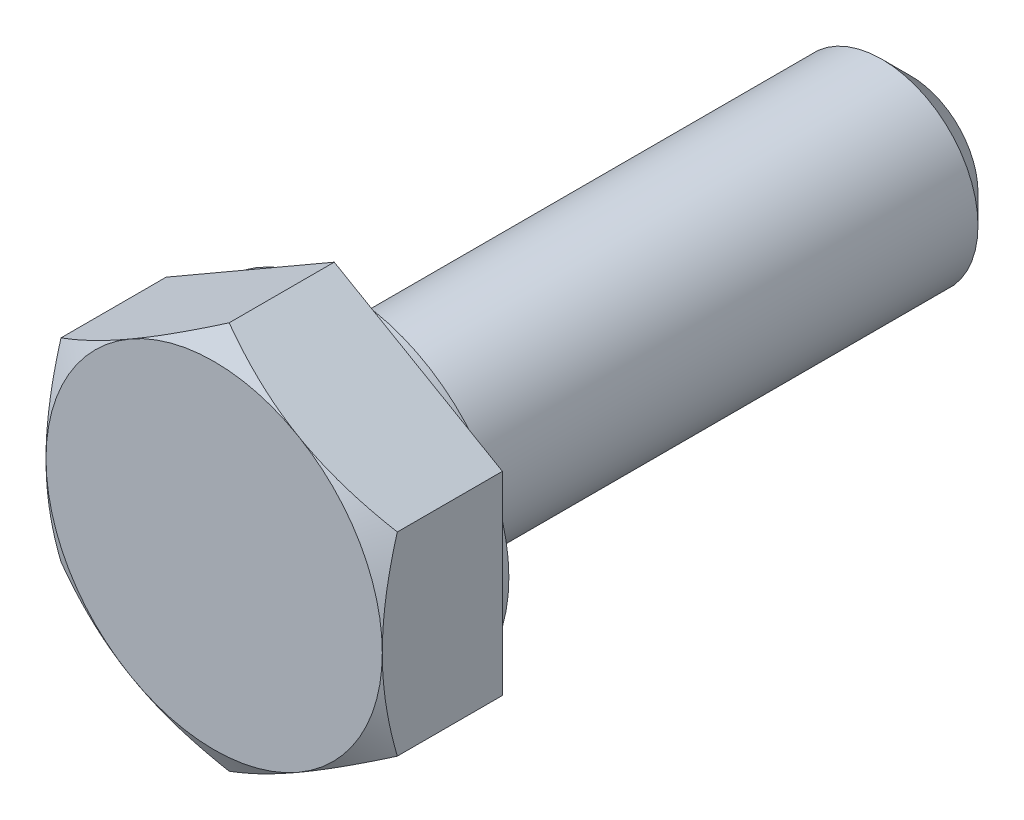
ISO-10303-21;
HEADER;
FILE_DESCRIPTION(('STEP AP214'),'2;1');
FILE_NAME('part.step','',(''),(''),'','','');
FILE_SCHEMA(('AUTOMOTIVE_DESIGN { 1 0 10303 214 1 1 1 1 }'));
ENDSEC;
DATA;
#1=APPLICATION_CONTEXT('core data for automotive mechanical design processes');
#2=APPLICATION_PROTOCOL_DEFINITION('international standard','automotive_design',2000,#1);
#3=PRODUCT_CONTEXT('',#1,'mechanical');
#4=PRODUCT('Part','Part','',(#3));
#5=PRODUCT_RELATED_PRODUCT_CATEGORY('part','',(#4));
#6=PRODUCT_DEFINITION_FORMATION('','',#4);
#7=PRODUCT_DEFINITION_CONTEXT('part definition',#1,'design');
#8=PRODUCT_DEFINITION('design','',#6,#7);
#9=PRODUCT_DEFINITION_SHAPE('','',#8);
#10=(LENGTH_UNIT() NAMED_UNIT(*) SI_UNIT(.MILLI.,.METRE.));
#11=(NAMED_UNIT(*) PLANE_ANGLE_UNIT() SI_UNIT($,.RADIAN.));
#12=(NAMED_UNIT(*) SI_UNIT($,.STERADIAN.) SOLID_ANGLE_UNIT());
#13=UNCERTAINTY_MEASURE_WITH_UNIT(LENGTH_MEASURE(1.E-05),#10,'distance_accuracy_value','');
#14=(GEOMETRIC_REPRESENTATION_CONTEXT(3) GLOBAL_UNCERTAINTY_ASSIGNED_CONTEXT((#13)) GLOBAL_UNIT_ASSIGNED_CONTEXT((#10,
#11,#12)) REPRESENTATION_CONTEXT('',''));
#15=CARTESIAN_POINT('',(0.,0.,0.));
#16=DIRECTION('',(0.,0.,1.));
#17=DIRECTION('',(1.,0.,0.));
#18=AXIS2_PLACEMENT_3D('',#15,#16,#17);
#19=CARTESIAN_POINT('',(5.55624999999998,3.20790243318487,3.96875));
#20=DIRECTION('',(-0.499999999999999,-0.866025403784439,0.));
#21=DIRECTION('',(0.866025403784439,-0.5,0.));
#22=AXIS2_PLACEMENT_3D('',#19,#20,#21);
#23=PLANE('',#22);
#24=CARTESIAN_POINT('',(5.55644999999998,3.20778696313103,3.47241909805179));
#25=CARTESIAN_POINT('',(5.43431700443225,3.278300480999,3.51312443962874));
#26=CARTESIAN_POINT('',(5.31172863757362,3.34907690760434,3.55198246063681));
#27=CARTESIAN_POINT('',(5.06555635055762,3.49120454378006,3.62549506657543));
#28=CARTESIAN_POINT('',(4.94197202526349,3.56255598725624,3.66014783819809));
#29=CARTESIAN_POINT('',(4.56924027919932,3.77775276118191,3.75711811443887));
#30=CARTESIAN_POINT('',(4.31862154881048,3.92244755263587,3.81227394549797));
#31=CARTESIAN_POINT('',(3.94357517172044,4.1389806794074,3.876951095153));
#32=CARTESIAN_POINT('',(3.82026814788995,4.2101720228089,3.89537582963737));
#33=CARTESIAN_POINT('',(3.57309692257776,4.35287639627882,3.92627163375965));
#34=CARTESIAN_POINT('',(3.44923277130252,4.42438939736053,3.93874322943797));
#35=CARTESIAN_POINT('',(3.20128932668296,4.56753961185543,3.95741491340171));
#36=CARTESIAN_POINT('',(3.07721043832554,4.63917659144934,3.96362211931662));
#37=CARTESIAN_POINT('',(2.82894487332449,4.78251278223321,3.96963858258616));
#38=CARTESIAN_POINT('',(2.70475820012893,4.85421199143243,3.96944803757272));
#39=CARTESIAN_POINT('',(2.36452243746778,5.05064720059278,3.96013175730709));
#40=CARTESIAN_POINT('',(2.14858470770917,5.17531890699711,3.94449034031059));
#41=CARTESIAN_POINT('',(1.71814349723525,5.42383425573454,3.89489009502544));
#42=CARTESIAN_POINT('',(1.50364153044715,5.54767702400135,3.86091431173333));
#43=CARTESIAN_POINT('',(1.07233397329163,5.79669255822861,3.77598424995191));
#44=CARTESIAN_POINT('',(0.855582809091892,5.92183390122649,3.72467011195787));
#45=CARTESIAN_POINT('',(0.425312954659244,6.17025031750736,3.6082075447076));
#46=CARTESIAN_POINT('',(0.21178875358562,6.29352857247572,3.54308647412056));
#47=CARTESIAN_POINT('',(-0.000200000000000074,6.41592033642355,3.47241909805179));
#48=B_SPLINE_CURVE_WITH_KNOTS('',3,(#24,#25,#26,#27,#28,#29,#30,#31,#32,#33,#34,#35,#36,#37,#38,
#39,#40,#41,#42,#43,#44,#45,#46,#47),.UNSPECIFIED.,.F.,.F.,(4,2,2,2,2,2,2,2,2,2,2,4),(0.,
0.44031690826804,0.880823012040822,1.76366572331169,2.19427472390782,2.62484566732156,
3.05492684132791,3.48499472977669,4.23370964386674,4.98311813377592,5.74914806559354,
6.5136740501687),.UNSPECIFIED.);
#49=CARTESIAN_POINT('',(5.55624999999998,3.20790243318487,3.4724857665182));
#50=VERTEX_POINT('',#49);
#51=CARTESIAN_POINT('',(2.778125,4.81185364977729,3.96875));
#52=VERTEX_POINT('',#51);
#53=EDGE_CURVE('E112',#50,#52,#48,.T.);
#54=ORIENTED_EDGE('',*,*,#53,.F.);
#55=DIRECTION('',(0.,0.,-1.));
#56=VECTOR('',#55,1.);
#57=CARTESIAN_POINT('',(5.55624999999998,3.20790243318487,3.96875));
#58=LINE('',#57,#56);
#59=CARTESIAN_POINT('',(5.55624999999998,3.20790243318487,0.));
#60=VERTEX_POINT('',#59);
#61=EDGE_CURVE('E61',#50,#60,#58,.T.);
#62=ORIENTED_EDGE('',*,*,#61,.T.);
#63=DIRECTION('',(-0.866025403784439,0.499999999999999,0.));
#64=VECTOR('',#63,1.);
#65=CARTESIAN_POINT('',(5.55624999999998,3.20790243318487,0.));
#66=LINE('',#65,#64);
#67=CARTESIAN_POINT('',(0.,6.41580486636971,0.));
#68=VERTEX_POINT('',#67);
#69=EDGE_CURVE('E243',#60,#68,#66,.T.);
#70=ORIENTED_EDGE('',*,*,#69,.T.);
#71=DIRECTION('',(0.,0.,-1.));
#72=VECTOR('',#71,1.);
#73=CARTESIAN_POINT('',(0.,6.41580486636971,3.96875));
#74=LINE('',#73,#72);
#75=CARTESIAN_POINT('',(0.,6.41580486636971,3.4724857665182));
#76=VERTEX_POINT('',#75);
#77=EDGE_CURVE('E132',#76,#68,#74,.T.);
#78=ORIENTED_EDGE('',*,*,#77,.F.);
#79=EDGE_CURVE('E120',#52,#76,#48,.T.);
#80=ORIENTED_EDGE('',*,*,#79,.F.);
#81=EDGE_LOOP('',(#54,#62,#70,#78,#80));
#82=FACE_BOUND('',#81,.T.);
#83=ADVANCED_FACE('F38',(#82),#23,.F.);
#84=CARTESIAN_POINT('',(0.,6.41580486636971,3.96875));
#85=DIRECTION('',(0.5,-0.866025403784438,0.));
#86=DIRECTION('',(0.866025403784439,0.5,0.));
#87=AXIS2_PLACEMENT_3D('',#84,#85,#86);
#88=PLANE('',#87);
#89=CARTESIAN_POINT('',(0.000199999999999678,6.41592033642355,3.47241909805179));
#90=CARTESIAN_POINT('',(-0.121932995567731,6.34540681855559,3.51312443962873));
#91=CARTESIAN_POINT('',(-0.244521362426353,6.27463039195024,3.5519824606368));
#92=CARTESIAN_POINT('',(-0.490693649442356,6.13250275577453,3.62549506657542));
#93=CARTESIAN_POINT('',(-0.614277974736487,6.06115131229834,3.66014783819809));
#94=CARTESIAN_POINT('',(-0.987009720800662,5.84595453837267,3.75711811443887));
#95=CARTESIAN_POINT('',(-1.2376284511895,5.70125974691871,3.81227394549796));
#96=CARTESIAN_POINT('',(-1.61267482827954,5.48472662014719,3.87695109515299));
#97=CARTESIAN_POINT('',(-1.73598185211002,5.41353527674569,3.89537582963736));
#98=CARTESIAN_POINT('',(-1.98315307742221,5.27083090327576,3.92627163375964));
#99=CARTESIAN_POINT('',(-2.10701722869746,5.19931790219406,3.93874322943797));
#100=CARTESIAN_POINT('',(-2.35496067331701,5.05616768769915,3.95741491340171));
#101=CARTESIAN_POINT('',(-2.47903956167444,4.98453070810525,3.96362211931662));
#102=CARTESIAN_POINT('',(-2.72730512667549,4.84119451732137,3.96963858258616));
#103=CARTESIAN_POINT('',(-2.85149179987105,4.76949530812215,3.96944803757272));
#104=CARTESIAN_POINT('',(-3.19172756253221,4.5730600989618,3.9601317573071));
#105=CARTESIAN_POINT('',(-3.40766529229081,4.44838839255747,3.94449034031059));
#106=CARTESIAN_POINT('',(-3.83810650276474,4.19987304382004,3.89489009502544));
#107=CARTESIAN_POINT('',(-4.05260846955284,4.07603027555322,3.86091431173333));
#108=CARTESIAN_POINT('',(-4.48391602670836,3.82701474132597,3.77598424995191));
#109=CARTESIAN_POINT('',(-4.7006671909081,3.70187339832808,3.72467011195788));
#110=CARTESIAN_POINT('',(-5.13093704534075,3.45345698204721,3.6082075447076));
#111=CARTESIAN_POINT('',(-5.34446124641438,3.33017872707885,3.54308647412056));
#112=CARTESIAN_POINT('',(-5.55645,3.20778696313102,3.47241909805179));
#113=B_SPLINE_CURVE_WITH_KNOTS('',3,(#89,#90,#91,#92,#93,#94,#95,#96,#97,#98,#99,#100,#101,#102,
#103,#104,#105,#106,#107,#108,#109,#110,#111,#112),.UNSPECIFIED.,.F.,.F.,(4,2,2,2,2,2,2,2,2,2,2,
4),(0.,0.440316908268041,0.880823012040822,1.76366572331169,2.19427472390783,2.62484566732156,
3.05492684132792,3.48499472977669,4.23370964386674,4.98311813377593,5.74914806559356,
6.51367405016872),.UNSPECIFIED.);
#114=CARTESIAN_POINT('',(-2.778125,4.81185364977729,3.96875));
#115=VERTEX_POINT('',#114);
#116=EDGE_CURVE('E125',#76,#115,#113,.T.);
#117=ORIENTED_EDGE('',*,*,#116,.F.);
#118=ORIENTED_EDGE('',*,*,#77,.T.);
#119=DIRECTION('',(-0.866025403784438,-0.5,0.));
#120=VECTOR('',#119,1.);
#121=CARTESIAN_POINT('',(0.,6.41580486636971,0.));
#122=LINE('',#121,#120);
#123=CARTESIAN_POINT('',(-5.55625,3.20790243318485,0.));
#124=VERTEX_POINT('',#123);
#125=EDGE_CURVE('E274',#68,#124,#122,.T.);
#126=ORIENTED_EDGE('',*,*,#125,.T.);
#127=DIRECTION('',(0.,0.,-1.));
#128=VECTOR('',#127,1.);
#129=CARTESIAN_POINT('',(-5.55625,3.20790243318485,3.96875));
#130=LINE('',#129,#128);
#131=CARTESIAN_POINT('',(-5.55625,3.20790243318485,3.4724857665182));
#132=VERTEX_POINT('',#131);
#133=EDGE_CURVE('E206',#132,#124,#130,.T.);
#134=ORIENTED_EDGE('',*,*,#133,.F.);
#135=EDGE_CURVE('E133',#115,#132,#113,.T.);
#136=ORIENTED_EDGE('',*,*,#135,.F.);
#137=EDGE_LOOP('',(#117,#118,#126,#134,#136));
#138=FACE_BOUND('',#137,.T.);
#139=ADVANCED_FACE('F194',(#138),#88,.F.);
#140=CARTESIAN_POINT('',(-5.55625,3.20790243318485,3.96875));
#141=DIRECTION('',(1.,0.,0.));
#142=DIRECTION('',(0.,1.,0.));
#143=AXIS2_PLACEMENT_3D('',#140,#141,#142);
#144=PLANE('',#143);
#145=CARTESIAN_POINT('',(-5.55624999999999,-8.71597197589096,1.20895936838402));
#146=CARTESIAN_POINT('',(-5.55624999999999,-8.47241296409869,1.32750261477903));
#147=CARTESIAN_POINT('',(-5.55624999999999,-8.22830531735481,1.44493743378603));
#148=CARTESIAN_POINT('',(-5.55624999999999,-7.73870130763707,1.67696863713966));
#149=CARTESIAN_POINT('',(-5.55624999999999,-7.49320474163489,1.79156459261281));
#150=CARTESIAN_POINT('',(-5.55624999999999,-6.99931388528676,2.01785180069114));
#151=CARTESIAN_POINT('',(-5.55624999999999,-6.75091115168741,2.1295246870791));
#152=CARTESIAN_POINT('',(-5.55624999999999,-6.2521639908269,2.3484300688484));
#153=CARTESIAN_POINT('',(-5.55624999999999,-6.00181965317578,2.45566276772489));
#154=CARTESIAN_POINT('',(-5.55624999999999,-5.49040404527405,2.66800096390127));
#155=CARTESIAN_POINT('',(-5.55624999999999,-5.22925341544628,2.77291633787696));
#156=CARTESIAN_POINT('',(-5.55624999999999,-4.70393363568155,2.97504404113674));
#157=CARTESIAN_POINT('',(-5.55624999999999,-4.43976415626272,3.07225552023888));
#158=CARTESIAN_POINT('',(-5.55624999999999,-3.90845027057385,3.25649660229481));
#159=CARTESIAN_POINT('',(-5.55625,-3.64131278498993,3.34354597129476));
#160=CARTESIAN_POINT('',(-5.55625,-3.10320429675299,3.50473464713745));
#161=CARTESIAN_POINT('',(-5.55625,-2.832234498072,3.57887791529104));
#162=CARTESIAN_POINT('',(-5.55625,-2.28781102500664,3.71037429118955));
#163=CARTESIAN_POINT('',(-5.55625,-2.01438008099471,3.76782003002887));
#164=CARTESIAN_POINT('',(-5.55625,-1.46397793179865,3.86272174779443));
#165=CARTESIAN_POINT('',(-5.55625,-1.18700710592821,3.9001798503959));
#166=CARTESIAN_POINT('',(-5.55625,-0.771839679912924,3.93889421562293));
#167=CARTESIAN_POINT('',(-5.55625,-0.634423749641007,3.94887693829777));
#168=CARTESIAN_POINT('',(-5.55625,-0.359297221803357,3.96302182863519));
#169=CARTESIAN_POINT('',(-5.55625,-0.22158665325804,3.96718454529278));
#170=CARTESIAN_POINT('',(-5.55625,0.0538978108301087,3.96958502033793));
#171=CARTESIAN_POINT('',(-5.55625,0.191671710872562,3.96782225831538));
#172=CARTESIAN_POINT('',(-5.55625,0.467008987046525,3.95841701240332));
#173=CARTESIAN_POINT('',(-5.55625,0.604572370968433,3.95077475163525));
#174=CARTESIAN_POINT('',(-5.55625,0.932168884806749,3.92573817103705));
#175=CARTESIAN_POINT('',(-5.55625,1.12200607322251,3.90572161535062));
#176=CARTESIAN_POINT('',(-5.55625,1.50032750379436,3.85556055619634));
#177=CARTESIAN_POINT('',(-5.55625,1.68881157040595,3.82541476204539));
#178=CARTESIAN_POINT('',(-5.55625,2.25198169534108,3.72137741513223));
#179=CARTESIAN_POINT('',(-5.55625,2.62419475393417,3.63390247129672));
#180=CARTESIAN_POINT('',(-5.55625,3.18100797492548,3.48146888639166));
#181=CARTESIAN_POINT('',(-5.55625,3.36847421705844,3.42637134799022));
#182=CARTESIAN_POINT('',(-5.55625,3.74158722651249,3.31027130143731));
#183=CARTESIAN_POINT('',(-5.55625,3.92723398010884,3.24926874878089));
#184=CARTESIAN_POINT('',(-5.55625,4.29676489315347,3.12235263347074));
#185=CARTESIAN_POINT('',(-5.55625,4.48064955094134,3.05644050851147));
#186=CARTESIAN_POINT('',(-5.55625,4.84688123315617,2.92049906069248));
#187=CARTESIAN_POINT('',(-5.55625,5.02922829026885,2.85046982560627));
#188=CARTESIAN_POINT('',(-5.55625,5.51260356360177,2.65956817843864));
#189=CARTESIAN_POINT('',(-5.55625,5.81243783833987,2.53567575626561));
#190=CARTESIAN_POINT('',(-5.55625,6.4090880324996,2.28079960770116));
#191=CARTESIAN_POINT('',(-5.55625,6.70590363602894,2.14981514804327));
#192=CARTESIAN_POINT('',(-5.55625,7.29719433999666,1.88240435577592));
#193=CARTESIAN_POINT('',(-5.55625,7.59166855675315,1.74597607555505));
#194=CARTESIAN_POINT('',(-5.55625,8.17863205835624,1.46895611286935));
#195=CARTESIAN_POINT('',(-5.55625,8.47112141765611,1.32836458764344));
#196=CARTESIAN_POINT('',(-5.55625,9.05495036566683,1.0436931489817));
#197=CARTESIAN_POINT('',(-5.55625,9.3462874994103,0.899608210793671));
#198=CARTESIAN_POINT('',(-5.55625,9.92765328283016,0.608821548770113));
#199=CARTESIAN_POINT('',(-5.55625,10.2176819224101,0.462119804786124));
#200=CARTESIAN_POINT('',(-5.55625,11.086043822171,0.0189390189812623));
#201=CARTESIAN_POINT('',(-5.55625,11.6627758901527,-0.280676042085872));
#202=CARTESIAN_POINT('',(-5.55625,12.75396623633,-0.854339993367395));
#203=CARTESIAN_POINT('',(-5.55625,13.2687144904607,-1.12783995506381));
#204=CARTESIAN_POINT('',(-5.55625,14.2964629846299,-1.67817398282487));
#205=CARTESIAN_POINT('',(-5.55625000000001,14.8094631217021,-1.95500824107306));
#206=CARTESIAN_POINT('',(-5.55625000000001,15.8324606500401,-2.51025174092163));
#207=CARTESIAN_POINT('',(-5.55625000000001,16.3424623864486,-2.78865298948855));
#208=CARTESIAN_POINT('',(-5.55625000000001,17.3613731615141,-3.34735795169409));
#209=CARTESIAN_POINT('',(-5.55625000000001,17.8702822796274,-3.62766152036859));
#210=CARTESIAN_POINT('',(-5.55625000000001,18.3788054198964,-3.90865921068141));
#211=B_SPLINE_CURVE_WITH_KNOTS('',3,(#145,#146,#147,#148,#149,#150,#151,#152,#153,#154,#155,
#156,#157,#158,#159,#160,#161,#162,#163,#164,#165,#166,#167,#168,#169,#170,#171,#172,#173,#174,
#175,#176,#177,#178,#179,#180,#181,#182,#183,#184,#185,#186,#187,#188,#189,#190,#191,#192,#193,
#194,#195,#196,#197,#198,#199,#200,#201,#202,#203,#204,#205,#206,#207,#208,#209,#210),
.UNSPECIFIED.,.F.,.F.,(4,2,2,2,2,2,2,2,2,2,2,2,2,2,2,2,2,2,2,2,2,2,2,2,2,2,2,2,2,2,2,2,4),(0.,
0.8126357300373,1.62539348720883,2.44240990583192,3.25938883880611,4.10360649371243,
4.94791718493774,5.79055725795246,6.63293823895167,7.4705527161171,8.30807817948145,
8.72130784757779,9.13449853352612,9.54772550924044,9.96093680415344,10.5332843779703,
11.1057049088676,12.2511183019659,12.8372525582557,13.4233912324707,14.0093589345136,
14.5953141487179,15.5684465207287,16.5416797005852,17.5152642477029,18.4888120709115,
19.4638547173108,20.4389048744288,22.3885945242527,24.1372706606077,25.8860480748471,
27.6291677632043,29.3721560781684),.UNSPECIFIED.);
#212=CARTESIAN_POINT('',(-5.55625,0.,3.96875));
#213=VERTEX_POINT('',#212);
#214=EDGE_CURVE('E188',#132,#213,#211,.F.);
#215=ORIENTED_EDGE('',*,*,#214,.F.);
#216=ORIENTED_EDGE('',*,*,#133,.T.);
#217=DIRECTION('',(0.,-1.,0.));
#218=VECTOR('',#217,1.);
#219=CARTESIAN_POINT('',(-5.55625,3.20790243318485,0.));
#220=LINE('',#219,#218);
#221=CARTESIAN_POINT('',(-5.55625,-3.20790243318485,0.));
#222=VERTEX_POINT('',#221);
#223=EDGE_CURVE('E224',#124,#222,#220,.T.);
#224=ORIENTED_EDGE('',*,*,#223,.T.);
#225=DIRECTION('',(0.,0.,-1.));
#226=VECTOR('',#225,1.);
#227=CARTESIAN_POINT('',(-5.55625,-3.20790243318485,3.96875));
#228=LINE('',#227,#226);
#229=CARTESIAN_POINT('',(-5.55625,-3.20790243318485,3.4724857665182));
#230=VERTEX_POINT('',#229);
#231=EDGE_CURVE('E222',#230,#222,#228,.T.);
#232=ORIENTED_EDGE('',*,*,#231,.F.);
#233=EDGE_CURVE('E182',#213,#230,#211,.F.);
#234=ORIENTED_EDGE('',*,*,#233,.F.);
#235=EDGE_LOOP('',(#215,#216,#224,#232,#234));
#236=FACE_BOUND('',#235,.T.);
#237=ADVANCED_FACE('F190',(#236),#144,.F.);
#238=CARTESIAN_POINT('',(-5.55625,-3.20790243318485,3.96875));
#239=DIRECTION('',(0.5,0.866025403784439,0.));
#240=DIRECTION('',(-0.866025403784439,0.5,0.));
#241=AXIS2_PLACEMENT_3D('',#238,#239,#240);
#242=PLANE('',#241);
#243=CARTESIAN_POINT('',(-5.55644999999999,-3.20778696313101,3.47241909805179));
#244=CARTESIAN_POINT('',(-5.43431700443226,-3.27830048099898,3.51312443962873));
#245=CARTESIAN_POINT('',(-5.31172863757364,-3.34907690760432,3.55198246063681));
#246=CARTESIAN_POINT('',(-5.06555635055764,-3.49120454378003,3.62549506657543));
#247=CARTESIAN_POINT('',(-4.94197202526351,-3.56255598725622,3.66014783819809));
#248=CARTESIAN_POINT('',(-4.56924027919933,-3.77775276118189,3.75711811443887));
#249=CARTESIAN_POINT('',(-4.31862154881049,-3.92244755263585,3.81227394549797));
#250=CARTESIAN_POINT('',(-3.94357517172046,-4.13898067940737,3.876951095153));
#251=CARTESIAN_POINT('',(-3.82026814788997,-4.21017202280887,3.89537582963737));
#252=CARTESIAN_POINT('',(-3.57309692257778,-4.3528763962788,3.92627163375965));
#253=CARTESIAN_POINT('',(-3.44923277130254,-4.42438939736051,3.93874322943797));
#254=CARTESIAN_POINT('',(-3.20128932668298,-4.56753961185541,3.95741491340171));
#255=CARTESIAN_POINT('',(-3.07721043832556,-4.63917659144932,3.96362211931662));
#256=CARTESIAN_POINT('',(-2.82894487332451,-4.78251278223319,3.96963858258617));
#257=CARTESIAN_POINT('',(-2.70475820012895,-4.85421199143241,3.96944803757273));
#258=CARTESIAN_POINT('',(-2.36452243746779,-5.05064720059276,3.9601317573071));
#259=CARTESIAN_POINT('',(-2.14858470770919,-5.17531890699709,3.94449034031059));
#260=CARTESIAN_POINT('',(-1.71814349723526,-5.42383425573452,3.89489009502545));
#261=CARTESIAN_POINT('',(-1.50364153044716,-5.54767702400133,3.86091431173334));
#262=CARTESIAN_POINT('',(-1.07233397329165,-5.79669255822859,3.77598424995192));
#263=CARTESIAN_POINT('',(-0.855582809091903,-5.92183390122648,3.72467011195788));
#264=CARTESIAN_POINT('',(-0.425312954659253,-6.17025031750735,3.60820754470761));
#265=CARTESIAN_POINT('',(-0.211788753585627,-6.29352857247571,3.54308647412057));
#266=CARTESIAN_POINT('',(0.000199999999993116,-6.41592033642354,3.4724190980518));
#267=B_SPLINE_CURVE_WITH_KNOTS('',3,(#243,#244,#245,#246,#247,#248,#249,#250,#251,#252,#253,
#254,#255,#256,#257,#258,#259,#260,#261,#262,#263,#264,#265,#266),.UNSPECIFIED.,.F.,.F.,(4,2,2,
2,2,2,2,2,2,2,2,4),(0.,0.44031690826804,0.880823012040822,1.76366572331169,2.19427472390782,
2.62484566732156,3.05492684132791,3.48499472977669,4.23370964386674,4.98311813377592,
5.74914806559355,6.51367405016871),.UNSPECIFIED.);
#268=CARTESIAN_POINT('',(-2.778125,-4.81185364977729,3.96875));
#269=VERTEX_POINT('',#268);
#270=EDGE_CURVE('E189',#230,#269,#267,.T.);
#271=ORIENTED_EDGE('',*,*,#270,.F.);
#272=ORIENTED_EDGE('',*,*,#231,.T.);
#273=DIRECTION('',(0.866025403784439,-0.5,0.));
#274=VECTOR('',#273,1.);
#275=CARTESIAN_POINT('',(-5.55625,-3.20790243318485,0.));
#276=LINE('',#275,#274);
#277=CARTESIAN_POINT('',(0.,-6.4158048663697,0.));
#278=VERTEX_POINT('',#277);
#279=EDGE_CURVE('E271',#222,#278,#276,.T.);
#280=ORIENTED_EDGE('',*,*,#279,.T.);
#281=DIRECTION('',(0.,0.,-1.));
#282=VECTOR('',#281,1.);
#283=CARTESIAN_POINT('',(0.,-6.4158048663697,3.96875));
#284=LINE('',#283,#282);
#285=CARTESIAN_POINT('',(0.,-6.4158048663697,3.4724857665182));
#286=VERTEX_POINT('',#285);
#287=EDGE_CURVE('E228',#286,#278,#284,.T.);
#288=ORIENTED_EDGE('',*,*,#287,.F.);
#289=EDGE_CURVE('E176',#269,#286,#267,.T.);
#290=ORIENTED_EDGE('',*,*,#289,.F.);
#291=EDGE_LOOP('',(#271,#272,#280,#288,#290));
#292=FACE_BOUND('',#291,.T.);
#293=ADVANCED_FACE('F193',(#292),#242,.F.);
#294=CARTESIAN_POINT('',(0.,-6.4158048663697,3.96875));
#295=DIRECTION('',(-0.5,0.866025403784438,0.));
#296=DIRECTION('',(-0.866025403784438,-0.5,0.));
#297=AXIS2_PLACEMENT_3D('',#294,#295,#296);
#298=PLANE('',#297);
#299=CARTESIAN_POINT('',(-0.000200000000006559,-6.41592033642354,3.47241909805179));
#300=CARTESIAN_POINT('',(0.121932995567724,-6.34540681855557,3.51312443962874));
#301=CARTESIAN_POINT('',(0.244521362426345,-6.27463039195023,3.55198246063681));
#302=CARTESIAN_POINT('',(0.490693649442347,-6.13250275577452,3.62549506657543));
#303=CARTESIAN_POINT('',(0.614277974736478,-6.06115131229833,3.6601478381981));
#304=CARTESIAN_POINT('',(0.987009720800652,-5.84595453837266,3.75711811443888));
#305=CARTESIAN_POINT('',(1.23762845118949,-5.7012597469187,3.81227394549797));
#306=CARTESIAN_POINT('',(1.61267482827953,-5.48472662014717,3.876951095153));
#307=CARTESIAN_POINT('',(1.73598185211001,-5.41353527674567,3.89537582963737));
#308=CARTESIAN_POINT('',(1.9831530774222,-5.27083090327575,3.92627163375965));
#309=CARTESIAN_POINT('',(2.10701722869745,-5.19931790219404,3.93874322943798));
#310=CARTESIAN_POINT('',(2.354960673317,-5.05616768769914,3.95741491340172));
#311=CARTESIAN_POINT('',(2.47903956167442,-4.98453070810523,3.96362211931663));
#312=CARTESIAN_POINT('',(2.72730512667547,-4.84119451732136,3.96963858258617));
#313=CARTESIAN_POINT('',(2.85149179987103,-4.76949530812214,3.96944803757273));
#314=CARTESIAN_POINT('',(3.19172756253219,-4.57306009896178,3.96013175730711));
#315=CARTESIAN_POINT('',(3.40766529229079,-4.44838839255746,3.9444903403106));
#316=CARTESIAN_POINT('',(3.83810650276472,-4.19987304382003,3.89489009502545));
#317=CARTESIAN_POINT('',(4.05260846955282,-4.07603027555321,3.86091431173334));
#318=CARTESIAN_POINT('',(4.48391602670834,-3.82701474132595,3.77598424995193));
#319=CARTESIAN_POINT('',(4.70066719090808,-3.70187339832807,3.72467011195789));
#320=CARTESIAN_POINT('',(5.13093704534073,-3.4534569820472,3.60820754470761));
#321=CARTESIAN_POINT('',(5.34446124641436,-3.33017872707884,3.54308647412058));
#322=CARTESIAN_POINT('',(5.55644999999998,-3.20778696313101,3.4724190980518));
#323=B_SPLINE_CURVE_WITH_KNOTS('',3,(#299,#300,#301,#302,#303,#304,#305,#306,#307,#308,#309,
#310,#311,#312,#313,#314,#315,#316,#317,#318,#319,#320,#321,#322),.UNSPECIFIED.,.F.,.F.,(4,2,2,
2,2,2,2,2,2,2,2,4),(0.,0.440316908268039,0.88082301204082,1.76366572331168,2.19427472390782,
2.62484566732155,3.05492684132791,3.48499472977669,4.23370964386674,4.98311813377592,
5.74914806559355,6.51367405016871),.UNSPECIFIED.);
#324=CARTESIAN_POINT('',(2.778125,-4.81185364977729,3.96875));
#325=VERTEX_POINT('',#324);
#326=EDGE_CURVE('E255',#286,#325,#323,.T.);
#327=ORIENTED_EDGE('',*,*,#326,.F.);
#328=ORIENTED_EDGE('',*,*,#287,.T.);
#329=DIRECTION('',(0.866025403784438,0.5,0.));
#330=VECTOR('',#329,1.);
#331=CARTESIAN_POINT('',(0.,-6.4158048663697,0.));
#332=LINE('',#331,#330);
#333=CARTESIAN_POINT('',(5.55624999999998,-3.20790243318484,0.));
#334=VERTEX_POINT('',#333);
#335=EDGE_CURVE('E267',#278,#334,#332,.T.);
#336=ORIENTED_EDGE('',*,*,#335,.T.);
#337=DIRECTION('',(0.,0.,-1.));
#338=VECTOR('',#337,1.);
#339=CARTESIAN_POINT('',(5.55624999999998,-3.20790243318484,3.96875));
#340=LINE('',#339,#338);
#341=CARTESIAN_POINT('',(5.55624999999998,-3.2079024331852,3.47248576651844));
#342=VERTEX_POINT('',#341);
#343=EDGE_CURVE('E231',#342,#334,#340,.T.);
#344=ORIENTED_EDGE('',*,*,#343,.F.);
#345=EDGE_CURVE('E169',#325,#342,#323,.T.);
#346=ORIENTED_EDGE('',*,*,#345,.F.);
#347=EDGE_LOOP('',(#327,#328,#336,#344,#346));
#348=FACE_BOUND('',#347,.T.);
#349=ADVANCED_FACE('F254',(#348),#298,.F.);
#350=CARTESIAN_POINT('',(5.55624999999998,-3.20790243318484,3.96875));
#351=DIRECTION('',(-1.,0.,0.));
#352=DIRECTION('',(0.,-1.,0.));
#353=AXIS2_PLACEMENT_3D('',#350,#351,#352);
#354=PLANE('',#353);
#355=CARTESIAN_POINT('',(5.55624999999998,-8.71597197874925,1.20895936699249));
#356=CARTESIAN_POINT('',(5.55624999999998,-8.47241296686077,1.32750261344555));
#357=CARTESIAN_POINT('',(5.55624999999998,-8.22830532002062,1.44493743251057));
#358=CARTESIAN_POINT('',(5.55624999999998,-7.73870131011005,1.67696863597996));
#359=CARTESIAN_POINT('',(5.55624999999998,-7.49320474401131,1.79156459151085));
#360=CARTESIAN_POINT('',(5.55624999999998,-6.99931388746858,2.01785179970468));
#361=CARTESIAN_POINT('',(5.55624999999998,-6.7509111537712,2.12952468615041));
#362=CARTESIAN_POINT('',(5.55624999999998,-6.25216399271394,2.34843006803428));
#363=CARTESIAN_POINT('',(5.55624999999998,-6.00181965496411,2.45566276696757));
#364=CARTESIAN_POINT('',(5.55624999999998,-5.49040404685732,2.66800096325922));
#365=CARTESIAN_POINT('',(5.55624999999998,-5.22925341692312,2.77291633729323));
#366=CARTESIAN_POINT('',(5.55624999999998,-4.70393363694382,2.97504404066656));
#367=CARTESIAN_POINT('',(5.55624999999998,-4.43976415741685,3.07225551982392));
#368=CARTESIAN_POINT('',(5.55624999999998,-3.9084502715097,3.25649660198502));
#369=CARTESIAN_POINT('',(5.55624999999998,-3.64131278581565,3.34354597103495));
#370=CARTESIAN_POINT('',(5.55624999999998,-3.10320429735545,3.50473464696945));
#371=CARTESIAN_POINT('',(5.55624999999998,-2.83223449856133,3.5788779151649));
#372=CARTESIAN_POINT('',(5.55624999999998,-2.28781102521184,3.71037429114791));
#373=CARTESIAN_POINT('',(5.55624999999998,-2.01438008102812,3.76782003002664));
#374=CARTESIAN_POINT('',(5.55624999999998,-1.46397793148424,3.86272174784514));
#375=CARTESIAN_POINT('',(5.55624999999998,-1.18700710543777,3.90017985046012));
#376=CARTESIAN_POINT('',(5.55624999999998,-0.771839679159663,3.93889421568403));
#377=CARTESIAN_POINT('',(5.55624999999998,-0.634423748801407,3.94887693835404));
#378=CARTESIAN_POINT('',(5.55624999999998,-0.359297220791249,3.96302182867417));
#379=CARTESIAN_POINT('',(5.55624999999998,-0.221586652159762,3.96718454531929));
#380=CARTESIAN_POINT('',(5.55624999999998,0.0538978121001064,3.96958502033207));
#381=CARTESIAN_POINT('',(5.55624999999998,0.191671712228111,3.96782225828958));
#382=CARTESIAN_POINT('',(5.55624999999998,0.467008988572045,3.95841701233071));
#383=CARTESIAN_POINT('',(5.55624999999998,0.604572372578372,3.95077475153577));
#384=CARTESIAN_POINT('',(5.55624999999998,0.932168886546728,3.9257381708715));
#385=CARTESIAN_POINT('',(5.55624999999998,1.12200607500774,3.90572161514706));
#386=CARTESIAN_POINT('',(5.55624999999998,1.50032750566802,3.85556055591474));
#387=CARTESIAN_POINT('',(5.55624999999998,1.68881157232281,3.82541476172376));
#388=CARTESIAN_POINT('',(5.55624999999998,2.25198169738515,3.72137741468967));
#389=CARTESIAN_POINT('',(5.55624999999998,2.6241947560597,3.63390247077247));
#390=CARTESIAN_POINT('',(5.55624999999998,3.18100797717286,3.48146888574691));
#391=CARTESIAN_POINT('',(5.55624999999998,3.3684742193473,3.42637134730502));
#392=CARTESIAN_POINT('',(5.55624999999998,3.74158722888386,3.31027130067245));
#393=CARTESIAN_POINT('',(5.55624999999998,3.92723398252123,3.24926874797682));
#394=CARTESIAN_POINT('',(5.55624999999998,4.29676489564759,3.12235263258967));
#395=CARTESIAN_POINT('',(5.55624999999998,4.48064955347618,3.0564405075926));
#396=CARTESIAN_POINT('',(5.55624999999998,4.84688123577245,2.92049905969934));
#397=CARTESIAN_POINT('',(5.55624999999998,5.02922829292585,2.85046982457666));
#398=CARTESIAN_POINT('',(5.55624999999998,5.51260356628246,2.65956817734708));
#399=CARTESIAN_POINT('',(5.55624999999998,5.81243784100469,2.53567575515231));
#400=CARTESIAN_POINT('',(5.55624999999998,6.40908803513468,2.28079960655053));
#401=CARTESIAN_POINT('',(5.55624999999998,6.70590363865017,2.14981514687708));
#402=CARTESIAN_POINT('',(5.55624999999998,7.29719434259166,1.8824043545831));
#403=CARTESIAN_POINT('',(5.55624999999998,7.59166855933577,1.74597607435118));
#404=CARTESIAN_POINT('',(5.55624999999998,8.17863206091544,1.46895611164656));
#405=CARTESIAN_POINT('',(5.55624999999998,8.47112142020426,1.3283645864128));
#406=CARTESIAN_POINT('',(5.55624999999998,9.05495036819323,1.04369314773802));
#407=CARTESIAN_POINT('',(5.55624999999997,9.34628750192601,0.899608209544821));
#408=CARTESIAN_POINT('',(5.55624999999997,9.92765328532529,0.608821547512698));
#409=CARTESIAN_POINT('',(5.55624999999997,10.2176819248953,0.462119803525319));
#410=CARTESIAN_POINT('',(5.55624999999997,11.0860438246277,0.0189390177121698));
#411=CARTESIAN_POINT('',(5.55624999999997,11.6627758925917,-0.280676043357869));
#412=CARTESIAN_POINT('',(5.55624999999997,12.7539662387514,-0.854339994649492));
#413=CARTESIAN_POINT('',(5.55624999999997,13.2687144928819,-1.12783995635353));
#414=CARTESIAN_POINT('',(5.55624999999997,14.2964629870514,-1.67817398412829));
#415=CARTESIAN_POINT('',(5.55624999999997,14.8094631241242,-1.95500824238255));
#416=CARTESIAN_POINT('',(5.55624999999997,15.8324606524662,-2.51025174224351));
#417=CARTESIAN_POINT('',(5.55624999999997,16.3424623888781,-2.78865299081677));
#418=CARTESIAN_POINT('',(5.55624999999997,17.3613731639511,-3.34735795303428));
#419=CARTESIAN_POINT('',(5.55624999999997,17.8702822820683,-3.62766152171442));
#420=CARTESIAN_POINT('',(5.55624999999997,18.3788054223414,-3.90865921203264));
#421=B_SPLINE_CURVE_WITH_KNOTS('',3,(#355,#356,#357,#358,#359,#360,#361,#362,#363,#364,#365,
#366,#367,#368,#369,#370,#371,#372,#373,#374,#375,#376,#377,#378,#379,#380,#381,#382,#383,#384,
#385,#386,#387,#388,#389,#390,#391,#392,#393,#394,#395,#396,#397,#398,#399,#400,#401,#402,#403,
#404,#405,#406,#407,#408,#409,#410,#411,#412,#413,#414,#415,#416,#417,#418,#419,#420),
.UNSPECIFIED.,.F.,.F.,(4,2,2,2,2,2,2,2,2,2,2,2,2,2,2,2,2,2,2,2,2,2,2,2,2,2,2,2,2,2,2,2,4),(0.,
0.812635730373018,1.62539348788032,2.44240990684272,3.25938884015619,4.10360649542399,
4.94791718701089,5.79055726038601,6.63293824174534,7.47055271943836,8.30807818332954,
8.72130785168296,9.13449853788829,9.54772551385977,9.96093680902991,10.5332843829937,
11.1057049140378,12.2511183074305,12.837252563874,13.4233912382427,14.0093589404388,
14.5953141547965,15.5684465267884,16.5416797066259,17.5152642537238,18.4888120769129,
19.4638547232903,20.4389048803864,22.3885945301673,24.1372706665326,25.8860480807819,
27.6291677691575,29.3721560841401),.UNSPECIFIED.);
#422=CARTESIAN_POINT('',(5.55624999999998,0.,3.96875));
#423=VERTEX_POINT('',#422);
#424=EDGE_CURVE('E260',#342,#423,#421,.T.);
#425=ORIENTED_EDGE('',*,*,#424,.F.);
#426=ORIENTED_EDGE('',*,*,#343,.T.);
#427=DIRECTION('',(0.,1.,0.));
#428=VECTOR('',#427,1.);
#429=CARTESIAN_POINT('',(5.55624999999998,-3.20790243318484,0.));
#430=LINE('',#429,#428);
#431=EDGE_CURVE('E264',#334,#60,#430,.T.);
#432=ORIENTED_EDGE('',*,*,#431,.T.);
#433=ORIENTED_EDGE('',*,*,#61,.F.);
#434=EDGE_CURVE('E117',#423,#50,#421,.T.);
#435=ORIENTED_EDGE('',*,*,#434,.F.);
#436=EDGE_LOOP('',(#425,#426,#432,#433,#435));
#437=FACE_BOUND('',#436,.T.);
#438=ADVANCED_FACE('F262',(#437),#354,.F.);
#439=CARTESIAN_POINT('',(0.,0.,0.));
#440=DIRECTION('',(0.,0.,1.));
#441=DIRECTION('',(1.,0.,0.));
#442=AXIS2_PLACEMENT_3D('',#439,#440,#441);
#443=PLANE('',#442);
#444=CARTESIAN_POINT('',(0.,0.,0.));
#445=DIRECTION('',(0.,0.,1.));
#446=DIRECTION('',(1.,0.,0.));
#447=AXIS2_PLACEMENT_3D('',#444,#445,#446);
#448=CIRCLE('',#447,5.49275);
#449=CARTESIAN_POINT('',(5.49275,0.,0.));
#450=VERTEX_POINT('',#449);
#451=EDGE_CURVE('E236',#450,#450,#448,.F.);
#452=ORIENTED_EDGE('',*,*,#451,.F.);
#453=EDGE_LOOP('',(#452));
#454=FACE_BOUND('',#453,.T.);
#455=ORIENTED_EDGE('',*,*,#69,.F.);
#456=ORIENTED_EDGE('',*,*,#431,.F.);
#457=ORIENTED_EDGE('',*,*,#335,.F.);
#458=ORIENTED_EDGE('',*,*,#279,.F.);
#459=ORIENTED_EDGE('',*,*,#223,.F.);
#460=ORIENTED_EDGE('',*,*,#125,.F.);
#461=EDGE_LOOP('',(#455,#456,#457,#458,#459,#460));
#462=FACE_BOUND('',#461,.T.);
#463=ADVANCED_FACE('F276',(#454,#462),#443,.F.);
#464=CARTESIAN_POINT('',(0.,0.,-0.2778125));
#465=DIRECTION('',(0.,0.,1.));
#466=DIRECTION('',(1.,0.,0.));
#467=AXIS2_PLACEMENT_3D('',#464,#465,#466);
#468=CYLINDRICAL_SURFACE('',#467,5.49275);
#469=CARTESIAN_POINT('',(0.,0.,-0.2778125));
#470=DIRECTION('',(0.,0.,-1.));
#471=DIRECTION('',(-1.,0.,0.));
#472=AXIS2_PLACEMENT_3D('',#469,#470,#471);
#473=CIRCLE('',#472,5.49275);
#474=CARTESIAN_POINT('',(5.49275,0.,-0.2778125));
#475=VERTEX_POINT('',#474);
#476=EDGE_CURVE('E119',#475,#475,#473,.T.);
#477=CARTESIAN_POINT('',(5.49275,0.,-0.2778125));
#478=CARTESIAN_POINT('',(5.49275,0.,-0.274918619791667));
#479=CARTESIAN_POINT('',(5.49275,0.,-0.272024739583333));
#480=CARTESIAN_POINT('',(5.49275,0.,-0.266236979166667));
#481=CARTESIAN_POINT('',(5.49275,0.,-0.263343098958333));
#482=CARTESIAN_POINT('',(5.49275,0.,-0.257555338541667));
#483=CARTESIAN_POINT('',(5.49275,0.,-0.254661458333333));
#484=CARTESIAN_POINT('',(5.49275,0.,-0.248873697916667));
#485=CARTESIAN_POINT('',(5.49275,0.,-0.245979817708333));
#486=CARTESIAN_POINT('',(5.49275,0.,-0.240192057291667));
#487=CARTESIAN_POINT('',(5.49275,0.,-0.237298177083333));
#488=CARTESIAN_POINT('',(5.49275,0.,-0.231510416666667));
#489=CARTESIAN_POINT('',(5.49275,0.,-0.228616536458333));
#490=CARTESIAN_POINT('',(5.49275,0.,-0.222828776041667));
#491=CARTESIAN_POINT('',(5.49275,0.,-0.219934895833333));
#492=CARTESIAN_POINT('',(5.49275,0.,-0.214147135416667));
#493=CARTESIAN_POINT('',(5.49275,0.,-0.211253255208333));
#494=CARTESIAN_POINT('',(5.49275,0.,-0.205465494791667));
#495=CARTESIAN_POINT('',(5.49275,0.,-0.202571614583333));
#496=CARTESIAN_POINT('',(5.49275,0.,-0.196783854166667));
#497=CARTESIAN_POINT('',(5.49275,0.,-0.193889973958333));
#498=CARTESIAN_POINT('',(5.49275,0.,-0.188102213541667));
#499=CARTESIAN_POINT('',(5.49275,0.,-0.185208333333333));
#500=CARTESIAN_POINT('',(5.49275,0.,-0.179420572916667));
#501=CARTESIAN_POINT('',(5.49275,0.,-0.176526692708333));
#502=CARTESIAN_POINT('',(5.49275,0.,-0.170738932291667));
#503=CARTESIAN_POINT('',(5.49275,0.,-0.167845052083333));
#504=CARTESIAN_POINT('',(5.49275,0.,-0.162057291666667));
#505=CARTESIAN_POINT('',(5.49275,0.,-0.159163411458333));
#506=CARTESIAN_POINT('',(5.49275,0.,-0.153375651041667));
#507=CARTESIAN_POINT('',(5.49275,0.,-0.150481770833333));
#508=CARTESIAN_POINT('',(5.49275,0.,-0.144694010416667));
#509=CARTESIAN_POINT('',(5.49275,0.,-0.141800130208333));
#510=CARTESIAN_POINT('',(5.49275,0.,-0.136012369791667));
#511=CARTESIAN_POINT('',(5.49275,0.,-0.133118489583333));
#512=CARTESIAN_POINT('',(5.49275,0.,-0.127330729166667));
#513=CARTESIAN_POINT('',(5.49275,0.,-0.124436848958333));
#514=CARTESIAN_POINT('',(5.49275,0.,-0.118649088541667));
#515=CARTESIAN_POINT('',(5.49275,0.,-0.115755208333333));
#516=CARTESIAN_POINT('',(5.49275,0.,-0.109967447916667));
#517=CARTESIAN_POINT('',(5.49275,0.,-0.107073567708333));
#518=CARTESIAN_POINT('',(5.49275,0.,-0.101285807291667));
#519=CARTESIAN_POINT('',(5.49275,0.,-0.0983919270833333));
#520=CARTESIAN_POINT('',(5.49275,0.,-0.0926041666666666));
#521=CARTESIAN_POINT('',(5.49275,0.,-0.0897102864583333));
#522=CARTESIAN_POINT('',(5.49275,0.,-0.0839225260416667));
#523=CARTESIAN_POINT('',(5.49275,0.,-0.0810286458333333));
#524=CARTESIAN_POINT('',(5.49275,0.,-0.0752408854166666));
#525=CARTESIAN_POINT('',(5.49275,0.,-0.0723470052083333));
#526=CARTESIAN_POINT('',(5.49275,0.,-0.0665592447916666));
#527=CARTESIAN_POINT('',(5.49275,0.,-0.0636653645833333));
#528=CARTESIAN_POINT('',(5.49275,0.,-0.0578776041666666));
#529=CARTESIAN_POINT('',(5.49275,0.,-0.0549837239583333));
#530=CARTESIAN_POINT('',(5.49275,0.,-0.0491959635416666));
#531=CARTESIAN_POINT('',(5.49275,0.,-0.0463020833333333));
#532=CARTESIAN_POINT('',(5.49275,0.,-0.0405143229166666));
#533=CARTESIAN_POINT('',(5.49275,0.,-0.0376204427083333));
#534=CARTESIAN_POINT('',(5.49275,0.,-0.0318326822916666));
#535=CARTESIAN_POINT('',(5.49275,0.,-0.0289388020833333));
#536=CARTESIAN_POINT('',(5.49275,0.,-0.0231510416666667));
#537=CARTESIAN_POINT('',(5.49275,0.,-0.0202571614583334));
#538=CARTESIAN_POINT('',(5.49275,0.,-0.0144694010416667));
#539=CARTESIAN_POINT('',(5.49275,0.,-0.0115755208333333));
#540=CARTESIAN_POINT('',(5.49275,0.,-0.00578776041666667));
#541=CARTESIAN_POINT('',(5.49275,0.,-0.00289388020833334));
#542=CARTESIAN_POINT('',(5.49275,0.,0.));
#543=B_SPLINE_CURVE_WITH_KNOTS('',3,(#477,#478,#479,#480,#481,#482,#483,#484,#485,#486,#487,
#488,#489,#490,#491,#492,#493,#494,#495,#496,#497,#498,#499,#500,#501,#502,#503,#504,#505,#506,
#507,#508,#509,#510,#511,#512,#513,#514,#515,#516,#517,#518,#519,#520,#521,#522,#523,#524,#525,
#526,#527,#528,#529,#530,#531,#532,#533,#534,#535,#536,#537,#538,#539,#540,#541,#542),
.UNSPECIFIED.,.F.,.F.,(4,2,2,2,2,2,2,2,2,2,2,2,2,2,2,2,2,2,2,2,2,2,2,2,2,2,2,2,2,2,2,2,4),(0.,
0.00868164062500001,0.01736328125,0.026044921875,0.0347265625,0.043408203125,0.05208984375,
0.060771484375,0.069453125,0.078134765625,0.08681640625,0.095498046875,0.1041796875,
0.112861328125,0.12154296875,0.130224609375,0.13890625,0.147587890625,0.15626953125,
0.164951171875,0.1736328125,0.182314453125,0.19099609375,0.199677734375,0.208359375,
0.217041015625,0.22572265625,0.234404296875,0.2430859375,0.251767578125,0.26044921875,
0.269130859375,0.2778125),.UNSPECIFIED.);
#544=EDGE_CURVE('BSEAM302',#475,#450,#543,.T.);
#545=ORIENTED_EDGE('',*,*,#476,.F.);
#546=ORIENTED_EDGE('',*,*,#451,.T.);
#547=ORIENTED_EDGE('',*,*,#544,.T.);
#548=ORIENTED_EDGE('',*,*,#544,.F.);
#549=EDGE_LOOP('',(#545,#547,#546,#548));
#550=FACE_BOUND('',#549,.T.);
#551=ADVANCED_FACE('F302',(#550),#468,.T.);
#552=CARTESIAN_POINT('',(0.,0.,-0.2778125));
#553=DIRECTION('',(0.,0.,-1.));
#554=DIRECTION('',(-1.,0.,0.));
#555=AXIS2_PLACEMENT_3D('',#552,#553,#554);
#556=PLANE('',#555);
#557=CARTESIAN_POINT('',(0.,0.,-0.2778125));
#558=DIRECTION('',(0.,0.,-1.));
#559=DIRECTION('',(-1.,0.,0.));
#560=AXIS2_PLACEMENT_3D('',#557,#558,#559);
#561=CIRCLE('',#560,3.175);
#562=CARTESIAN_POINT('',(-3.175,0.,-0.2778125));
#563=VERTEX_POINT('',#562);
#564=EDGE_CURVE('E240',#563,#563,#561,.T.);
#565=ORIENTED_EDGE('',*,*,#564,.F.);
#566=EDGE_LOOP('',(#565));
#567=FACE_BOUND('',#566,.T.);
#568=ORIENTED_EDGE('',*,*,#476,.T.);
#569=EDGE_LOOP('',(#568));
#570=FACE_BOUND('',#569,.T.);
#571=ADVANCED_FACE('F155',(#567,#570),#556,.T.);
#572=CARTESIAN_POINT('',(0.,0.,-19.05));
#573=DIRECTION('',(0.,0.,1.));
#574=DIRECTION('',(1.,0.,0.));
#575=AXIS2_PLACEMENT_3D('',#572,#573,#574);
#576=PLANE('',#575);
#577=CARTESIAN_POINT('',(0.,0.,-19.05));
#578=DIRECTION('',(0.,0.,1.));
#579=DIRECTION('',(1.,0.,0.));
#580=AXIS2_PLACEMENT_3D('',#577,#578,#579);
#581=CIRCLE('',#580,2.2225);
#582=CARTESIAN_POINT('',(2.2225,0.,-19.05));
#583=VERTEX_POINT('',#582);
#584=EDGE_CURVE('E245',#583,#583,#581,.F.);
#585=ORIENTED_EDGE('',*,*,#584,.T.);
#586=EDGE_LOOP('',(#585));
#587=FACE_BOUND('',#586,.T.);
#588=ADVANCED_FACE('F293',(#587),#576,.F.);
#589=CARTESIAN_POINT('',(0.,0.,0.));
#590=DIRECTION('',(0.,0.,1.));
#591=DIRECTION('',(1.,0.,0.));
#592=AXIS2_PLACEMENT_3D('',#589,#590,#591);
#593=CYLINDRICAL_SURFACE('',#592,3.175);
#594=CARTESIAN_POINT('',(0.,0.,-18.0975));
#595=DIRECTION('',(0.,0.,1.));
#596=DIRECTION('',(1.,0.,0.));
#597=AXIS2_PLACEMENT_3D('',#594,#595,#596);
#598=CIRCLE('',#597,3.175);
#599=CARTESIAN_POINT('',(3.175,0.,-18.0975));
#600=VERTEX_POINT('',#599);
#601=EDGE_CURVE('E239',#600,#600,#598,.T.);
#602=ORIENTED_EDGE('',*,*,#601,.T.);
#603=EDGE_LOOP('',(#602));
#604=FACE_BOUND('',#603,.T.);
#605=ORIENTED_EDGE('',*,*,#564,.T.);
#606=EDGE_LOOP('',(#605));
#607=FACE_BOUND('',#606,.T.);
#608=ADVANCED_FACE('F288',(#604,#607),#593,.T.);
#609=CARTESIAN_POINT('',(0.,0.,-18.0975));
#610=DIRECTION('',(0.,0.,1.));
#611=DIRECTION('',(1.,0.,0.));
#612=AXIS2_PLACEMENT_3D('',#609,#610,#611);
#613=CONICAL_SURFACE('',#612,3.175,0.785398163397451);
#614=ORIENTED_EDGE('',*,*,#584,.F.);
#615=EDGE_LOOP('',(#614));
#616=FACE_BOUND('',#615,.T.);
#617=ORIENTED_EDGE('',*,*,#601,.F.);
#618=EDGE_LOOP('',(#617));
#619=FACE_BOUND('',#618,.T.);
#620=ADVANCED_FACE('F40',(#616,#619),#613,.T.);
#621=CARTESIAN_POINT('',(0.,0.,3.96875));
#622=DIRECTION('',(0.,0.,-1.));
#623=DIRECTION('',(1.,0.,0.));
#624=AXIS2_PLACEMENT_3D('',#621,#622,#623);
#625=CONICAL_SURFACE('',#624,5.55625,1.0471975511966);
#626=ORIENTED_EDGE('',*,*,#345,.T.);
#627=ORIENTED_EDGE('',*,*,#424,.T.);
#628=CARTESIAN_POINT('',(0.,0.,3.96875));
#629=DIRECTION('',(0.,0.,1.));
#630=DIRECTION('',(1.,0.,0.));
#631=AXIS2_PLACEMENT_3D('',#628,#629,#630);
#632=CIRCLE('',#631,5.55625);
#633=EDGE_CURVE('E42',#325,#423,#632,.T.);
#634=ORIENTED_EDGE('',*,*,#633,.F.);
#635=EDGE_LOOP('',(#626,#627,#634));
#636=FACE_BOUND('',#635,.T.);
#637=ADVANCED_FACE('F154',(#636),#625,.T.);
#638=ORIENTED_EDGE('',*,*,#289,.T.);
#639=ORIENTED_EDGE('',*,*,#326,.T.);
#640=EDGE_CURVE('E219',#269,#325,#632,.T.);
#641=ORIENTED_EDGE('',*,*,#640,.F.);
#642=EDGE_LOOP('',(#638,#639,#641));
#643=FACE_BOUND('',#642,.T.);
#644=ADVANCED_FACE('F278',(#643),#625,.T.);
#645=ORIENTED_EDGE('',*,*,#233,.T.);
#646=ORIENTED_EDGE('',*,*,#270,.T.);
#647=EDGE_CURVE('E214',#213,#269,#632,.T.);
#648=ORIENTED_EDGE('',*,*,#647,.F.);
#649=EDGE_LOOP('',(#645,#646,#648));
#650=FACE_BOUND('',#649,.T.);
#651=ADVANCED_FACE('F215',(#650),#625,.T.);
#652=ORIENTED_EDGE('',*,*,#135,.T.);
#653=ORIENTED_EDGE('',*,*,#214,.T.);
#654=EDGE_CURVE('E47',#115,#213,#632,.T.);
#655=ORIENTED_EDGE('',*,*,#654,.F.);
#656=EDGE_LOOP('',(#652,#653,#655));
#657=FACE_BOUND('',#656,.T.);
#658=ADVANCED_FACE('F210',(#657),#625,.T.);
#659=ORIENTED_EDGE('',*,*,#79,.T.);
#660=ORIENTED_EDGE('',*,*,#116,.T.);
#661=EDGE_CURVE('E12',#52,#115,#632,.T.);
#662=ORIENTED_EDGE('',*,*,#661,.F.);
#663=EDGE_LOOP('',(#659,#660,#662));
#664=FACE_BOUND('',#663,.T.);
#665=ADVANCED_FACE('F123',(#664),#625,.T.);
#666=ORIENTED_EDGE('',*,*,#53,.T.);
#667=CARTESIAN_POINT('',(0.,0.,3.96875));
#668=DIRECTION('',(0.,0.,1.));
#669=DIRECTION('',(1.,0.,0.));
#670=AXIS2_PLACEMENT_3D('',#667,#668,#669);
#671=CIRCLE('',#670,5.55625);
#672=EDGE_CURVE('E115',#423,#52,#671,.T.);
#673=ORIENTED_EDGE('',*,*,#672,.F.);
#674=ORIENTED_EDGE('',*,*,#434,.T.);
#675=EDGE_LOOP('',(#666,#673,#674));
#676=FACE_BOUND('',#675,.T.);
#677=ADVANCED_FACE('F114',(#676),#625,.T.);
#678=CARTESIAN_POINT('',(0.,0.,3.96875));
#679=DIRECTION('',(0.,0.,1.));
#680=DIRECTION('',(1.,0.,0.));
#681=AXIS2_PLACEMENT_3D('',#678,#679,#680);
#682=PLANE('',#681);
#683=ORIENTED_EDGE('',*,*,#633,.T.);
#684=ORIENTED_EDGE('',*,*,#672,.T.);
#685=ORIENTED_EDGE('',*,*,#661,.T.);
#686=ORIENTED_EDGE('',*,*,#654,.T.);
#687=ORIENTED_EDGE('',*,*,#647,.T.);
#688=ORIENTED_EDGE('',*,*,#640,.T.);
#689=EDGE_LOOP('',(#683,#684,#685,#686,#687,#688));
#690=FACE_BOUND('',#689,.T.);
#691=ADVANCED_FACE('F129',(#690),#682,.T.);
#692=CLOSED_SHELL('',(#83,#139,#237,#293,#349,#438,#463,#551,#571,#588,#608,#620,#637,#644,#651,
#658,#665,#677,#691));
#693=MANIFOLD_SOLID_BREP('B2',#692);
#694=ADVANCED_BREP_SHAPE_REPRESENTATION('',(#18,#693),#14);
#695=SHAPE_DEFINITION_REPRESENTATION(#9,#694);
ENDSEC;
END-ISO-10303-21;
